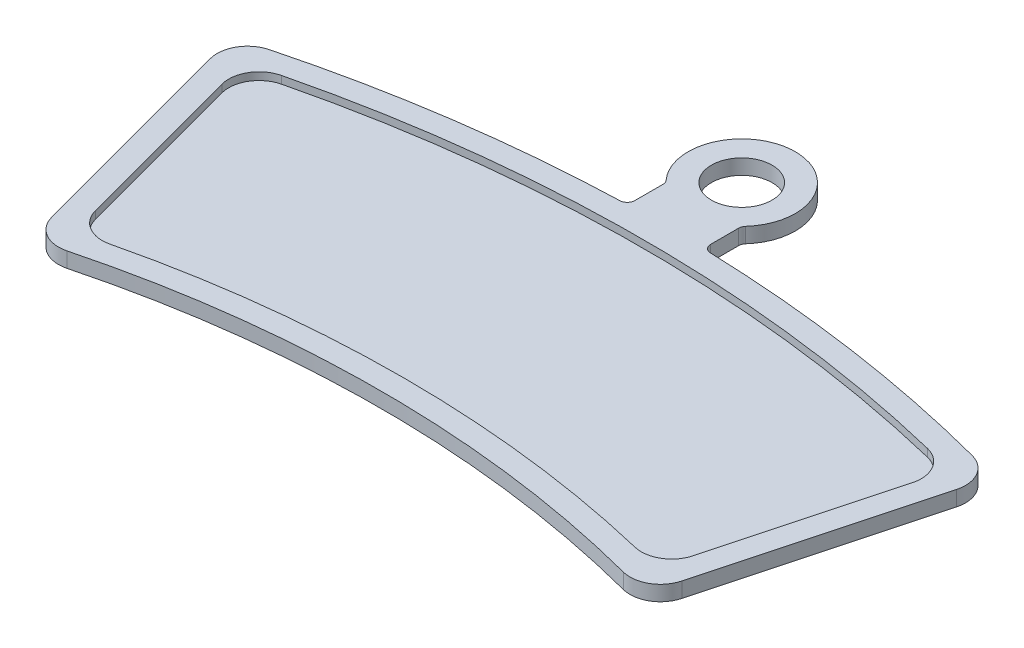
ISO-10303-21;
HEADER;
FILE_DESCRIPTION(('STEP AP214'),'2;1');
FILE_NAME('part.step','',(''),(''),'','','');
FILE_SCHEMA(('AUTOMOTIVE_DESIGN { 1 0 10303 214 1 1 1 1 }'));
ENDSEC;
DATA;
#1=APPLICATION_CONTEXT('core data for automotive mechanical design processes');
#2=APPLICATION_PROTOCOL_DEFINITION('international standard','automotive_design',2000,#1);
#3=PRODUCT_CONTEXT('',#1,'mechanical');
#4=PRODUCT('Part','Part','',(#3));
#5=PRODUCT_RELATED_PRODUCT_CATEGORY('part','',(#4));
#6=PRODUCT_DEFINITION_FORMATION('','',#4);
#7=PRODUCT_DEFINITION_CONTEXT('part definition',#1,'design');
#8=PRODUCT_DEFINITION('design','',#6,#7);
#9=PRODUCT_DEFINITION_SHAPE('','',#8);
#10=(LENGTH_UNIT() NAMED_UNIT(*) SI_UNIT(.MILLI.,.METRE.));
#11=(NAMED_UNIT(*) PLANE_ANGLE_UNIT() SI_UNIT($,.RADIAN.));
#12=(NAMED_UNIT(*) SI_UNIT($,.STERADIAN.) SOLID_ANGLE_UNIT());
#13=UNCERTAINTY_MEASURE_WITH_UNIT(LENGTH_MEASURE(1.E-05),#10,'distance_accuracy_value','');
#14=(GEOMETRIC_REPRESENTATION_CONTEXT(3) GLOBAL_UNCERTAINTY_ASSIGNED_CONTEXT((#13)) GLOBAL_UNIT_ASSIGNED_CONTEXT((#10,
#11,#12)) REPRESENTATION_CONTEXT('',''));
#15=CARTESIAN_POINT('',(0.,0.,0.));
#16=DIRECTION('',(0.,0.,1.));
#17=DIRECTION('',(1.,0.,0.));
#18=AXIS2_PLACEMENT_3D('',#15,#16,#17);
#19=CARTESIAN_POINT('',(0.,1.,0.));
#20=DIRECTION('',(0.,-1.,0.));
#21=DIRECTION('',(0.,0.,-1.));
#22=AXIS2_PLACEMENT_3D('',#19,#20,#21);
#23=CYLINDRICAL_SURFACE('',#22,91.5);
#24=CARTESIAN_POINT('',(0.,0.,0.));
#25=DIRECTION('',(0.,1.,0.));
#26=DIRECTION('',(0.,0.,1.));
#27=AXIS2_PLACEMENT_3D('',#24,#25,#26);
#28=CIRCLE('',#27,91.5);
#29=CARTESIAN_POINT('',(23.1878176866604,0.,-88.5131352451725));
#30=VERTEX_POINT('',#29);
#31=CARTESIAN_POINT('',(2.98346362364746,0.,-91.4513474193047));
#32=VERTEX_POINT('',#31);
#33=EDGE_CURVE('E365',#30,#32,#28,.T.);
#34=ORIENTED_EDGE('',*,*,#33,.T.);
#35=DIRECTION('',(0.,-1.,0.));
#36=VECTOR('',#35,1.);
#37=CARTESIAN_POINT('',(2.98346362364746,1.,-91.4513474193047));
#38=LINE('',#37,#36);
#39=CARTESIAN_POINT('',(2.98346362364746,1.,-91.4513474193047));
#40=VERTEX_POINT('',#39);
#41=EDGE_CURVE('E66',#32,#40,#38,.F.);
#42=ORIENTED_EDGE('',*,*,#41,.T.);
#43=CARTESIAN_POINT('',(0.,1.,0.));
#44=DIRECTION('',(0.,1.,0.));
#45=DIRECTION('',(0.,0.,1.));
#46=AXIS2_PLACEMENT_3D('',#43,#44,#45);
#47=CIRCLE('',#46,91.5);
#48=CARTESIAN_POINT('',(23.1878176866604,1.,-88.5131352451725));
#49=VERTEX_POINT('',#48);
#50=EDGE_CURVE('E243',#49,#40,#47,.T.);
#51=ORIENTED_EDGE('',*,*,#50,.F.);
#52=DIRECTION('',(0.,-1.,0.));
#53=VECTOR('',#52,1.);
#54=CARTESIAN_POINT('',(23.1878176866604,1.,-88.5131352451725));
#55=LINE('',#54,#53);
#56=EDGE_CURVE('E269',#49,#30,#55,.T.);
#57=ORIENTED_EDGE('',*,*,#56,.T.);
#58=EDGE_LOOP('',(#34,#42,#51,#57));
#59=FACE_BOUND('',#58,.T.);
#60=ADVANCED_FACE('F45',(#59),#23,.T.);
#61=CARTESIAN_POINT('',(2.49976670355811,1.,-91.4658469945355));
#62=DIRECTION('',(-1.,0.,0.));
#63=DIRECTION('',(0.,0.,1.));
#64=AXIS2_PLACEMENT_3D('',#61,#62,#63);
#65=PLANE('',#64);
#66=DIRECTION('',(0.,0.,-1.));
#67=VECTOR('',#66,1.);
#68=CARTESIAN_POINT('',(2.49976670355811,0.,-91.4658469945355));
#69=LINE('',#68,#67);
#70=CARTESIAN_POINT('',(2.49976670355811,0.,-91.951081558208));
#71=VERTEX_POINT('',#70);
#72=CARTESIAN_POINT('',(2.49976670355811,0.,-93.8008145227259));
#73=VERTEX_POINT('',#72);
#74=EDGE_CURVE('E360',#71,#73,#69,.T.);
#75=ORIENTED_EDGE('',*,*,#74,.T.);
#76=DIRECTION('',(0.,1.,0.));
#77=VECTOR('',#76,1.);
#78=CARTESIAN_POINT('',(2.49976670355811,1.,-93.8008145227259));
#79=LINE('',#78,#77);
#80=CARTESIAN_POINT('',(2.49976670355811,1.,-93.8008145227259));
#81=VERTEX_POINT('',#80);
#82=EDGE_CURVE('E316',#73,#81,#79,.T.);
#83=ORIENTED_EDGE('',*,*,#82,.T.);
#84=DIRECTION('',(0.,0.,-1.));
#85=VECTOR('',#84,1.);
#86=CARTESIAN_POINT('',(2.49976670355811,1.,-91.4658469945355));
#87=LINE('',#86,#85);
#88=CARTESIAN_POINT('',(2.49976670355811,1.,-91.951081558208));
#89=VERTEX_POINT('',#88);
#90=EDGE_CURVE('E378',#89,#81,#87,.T.);
#91=ORIENTED_EDGE('',*,*,#90,.F.);
#92=DIRECTION('',(0.,1.,0.));
#93=VECTOR('',#92,1.);
#94=CARTESIAN_POINT('',(2.49976670355811,0.,-91.951081558208));
#95=LINE('',#94,#93);
#96=EDGE_CURVE('E313',#89,#71,#95,.F.);
#97=ORIENTED_EDGE('',*,*,#96,.T.);
#98=EDGE_LOOP('',(#75,#83,#91,#97));
#99=FACE_BOUND('',#98,.T.);
#100=ADVANCED_FACE('F469',(#99),#65,.F.);
#101=CARTESIAN_POINT('',(0.,1.,-96.5));
#102=DIRECTION('',(0.,-1.,0.));
#103=DIRECTION('',(0.,0.,-1.));
#104=AXIS2_PLACEMENT_3D('',#101,#102,#103);
#105=CYLINDRICAL_SURFACE('',#104,3.53536894428541);
#106=CARTESIAN_POINT('',(0.,1.,-96.5));
#107=DIRECTION('',(0.,1.,0.));
#108=DIRECTION('',(0.,0.,1.));
#109=AXIS2_PLACEMENT_3D('',#106,#107,#108);
#110=CIRCLE('',#109,3.53536894428541);
#111=CARTESIAN_POINT('',(2.6280823860924,1.,-94.1352555013007));
#112=VERTEX_POINT('',#111);
#113=CARTESIAN_POINT('',(-2.62828677607677,1.,-94.1354826718931));
#114=VERTEX_POINT('',#113);
#115=EDGE_CURVE('E375',#112,#114,#110,.T.);
#116=ORIENTED_EDGE('',*,*,#115,.F.);
#117=DIRECTION('',(0.,-1.,0.));
#118=VECTOR('',#117,1.);
#119=CARTESIAN_POINT('',(2.6280823860924,1.,-94.1352555013007));
#120=LINE('',#119,#118);
#121=CARTESIAN_POINT('',(2.6280823860924,0.,-94.1352555013007));
#122=VERTEX_POINT('',#121);
#123=EDGE_CURVE('E310',#112,#122,#120,.T.);
#124=ORIENTED_EDGE('',*,*,#123,.T.);
#125=CARTESIAN_POINT('',(0.,0.,-96.5));
#126=DIRECTION('',(0.,1.,0.));
#127=DIRECTION('',(0.,0.,1.));
#128=AXIS2_PLACEMENT_3D('',#125,#126,#127);
#129=CIRCLE('',#128,3.53536894428541);
#130=CARTESIAN_POINT('',(-2.62828677607677,0.,-94.1354826718931));
#131=VERTEX_POINT('',#130);
#132=EDGE_CURVE('E358',#122,#131,#129,.T.);
#133=ORIENTED_EDGE('',*,*,#132,.T.);
#134=DIRECTION('',(0.,-1.,0.));
#135=VECTOR('',#134,1.);
#136=CARTESIAN_POINT('',(-2.62828677607677,1.,-94.1354826718931));
#137=LINE('',#136,#135);
#138=EDGE_CURVE('E308',#131,#114,#137,.F.);
#139=ORIENTED_EDGE('',*,*,#138,.T.);
#140=EDGE_LOOP('',(#116,#124,#133,#139));
#141=FACE_BOUND('',#140,.T.);
#142=ADVANCED_FACE('F474',(#141),#105,.T.);
#143=CARTESIAN_POINT('',(-2.5,1.,-91.465840618233));
#144=DIRECTION('',(1.,0.,0.));
#145=DIRECTION('',(0.,0.,-1.));
#146=AXIS2_PLACEMENT_3D('',#143,#144,#145);
#147=PLANE('',#146);
#148=DIRECTION('',(0.,0.,1.));
#149=VECTOR('',#148,1.);
#150=CARTESIAN_POINT('',(-2.5,1.,-91.465840618233));
#151=LINE('',#150,#149);
#152=CARTESIAN_POINT('',(-2.5,1.,-93.8010738215907));
#153=VERTEX_POINT('',#152);
#154=CARTESIAN_POINT('',(-2.5,1.,-91.9510739469637));
#155=VERTEX_POINT('',#154);
#156=EDGE_CURVE('E345',#153,#155,#151,.T.);
#157=ORIENTED_EDGE('',*,*,#156,.F.);
#158=DIRECTION('',(0.,1.,0.));
#159=VECTOR('',#158,1.);
#160=CARTESIAN_POINT('',(-2.5,0.,-93.8010738215907));
#161=LINE('',#160,#159);
#162=CARTESIAN_POINT('',(-2.5,0.,-93.8010738215907));
#163=VERTEX_POINT('',#162);
#164=EDGE_CURVE('E320',#153,#163,#161,.F.);
#165=ORIENTED_EDGE('',*,*,#164,.T.);
#166=DIRECTION('',(0.,0.,1.));
#167=VECTOR('',#166,1.);
#168=CARTESIAN_POINT('',(-2.5,0.,-91.465840618233));
#169=LINE('',#168,#167);
#170=CARTESIAN_POINT('',(-2.5,0.,-91.9510739469637));
#171=VERTEX_POINT('',#170);
#172=EDGE_CURVE('E237',#163,#171,#169,.T.);
#173=ORIENTED_EDGE('',*,*,#172,.T.);
#174=DIRECTION('',(0.,1.,0.));
#175=VECTOR('',#174,1.);
#176=CARTESIAN_POINT('',(-2.5,1.,-91.9510739469637));
#177=LINE('',#176,#175);
#178=EDGE_CURVE('E318',#171,#155,#177,.T.);
#179=ORIENTED_EDGE('',*,*,#178,.T.);
#180=EDGE_LOOP('',(#157,#165,#173,#179));
#181=FACE_BOUND('',#180,.T.);
#182=ADVANCED_FACE('F356',(#181),#147,.F.);
#183=CARTESIAN_POINT('',(0.,1.,0.));
#184=DIRECTION('',(0.,-1.,0.));
#185=DIRECTION('',(0.,0.,-1.));
#186=AXIS2_PLACEMENT_3D('',#183,#184,#185);
#187=CYLINDRICAL_SURFACE('',#186,91.5);
#188=CARTESIAN_POINT('',(0.,1.,0.));
#189=DIRECTION('',(0.,1.,0.));
#190=DIRECTION('',(0.,0.,1.));
#191=AXIS2_PLACEMENT_3D('',#188,#189,#190);
#192=CIRCLE('',#191,91.5);
#193=CARTESIAN_POINT('',(-2.98369565217391,1.,-91.4513398494259));
#194=VERTEX_POINT('',#193);
#195=CARTESIAN_POINT('',(-23.1878176866604,1.,-88.5131352451725));
#196=VERTEX_POINT('',#195);
#197=EDGE_CURVE('E343',#194,#196,#192,.T.);
#198=ORIENTED_EDGE('',*,*,#197,.F.);
#199=DIRECTION('',(0.,-1.,0.));
#200=VECTOR('',#199,1.);
#201=CARTESIAN_POINT('',(-2.98369565217391,1.,-91.4513398494259));
#202=LINE('',#201,#200);
#203=CARTESIAN_POINT('',(-2.98369565217391,0.,-91.4513398494259));
#204=VERTEX_POINT('',#203);
#205=EDGE_CURVE('E323',#194,#204,#202,.T.);
#206=ORIENTED_EDGE('',*,*,#205,.T.);
#207=CARTESIAN_POINT('',(0.,0.,0.));
#208=DIRECTION('',(0.,1.,0.));
#209=DIRECTION('',(0.,0.,1.));
#210=AXIS2_PLACEMENT_3D('',#207,#208,#209);
#211=CIRCLE('',#210,91.5);
#212=CARTESIAN_POINT('',(-23.1878176866604,0.,-88.5131352451725));
#213=VERTEX_POINT('',#212);
#214=EDGE_CURVE('E232',#204,#213,#211,.T.);
#215=ORIENTED_EDGE('',*,*,#214,.T.);
#216=DIRECTION('',(0.,-1.,0.));
#217=VECTOR('',#216,1.);
#218=CARTESIAN_POINT('',(-23.1878176866604,1.,-88.5131352451725));
#219=LINE('',#218,#217);
#220=EDGE_CURVE('E213',#213,#196,#219,.F.);
#221=ORIENTED_EDGE('',*,*,#220,.T.);
#222=EDGE_LOOP('',(#198,#206,#215,#221));
#223=FACE_BOUND('',#222,.T.);
#224=ADVANCED_FACE('F350',(#223),#187,.T.);
#225=CARTESIAN_POINT('',(-25.1276489511106,1.,-87.9821076025674));
#226=DIRECTION('',(0.96592582628907,0.,-0.258819045102514));
#227=DIRECTION('',(-0.258819045102514,0.,-0.96592582628907));
#228=AXIS2_PLACEMENT_3D('',#225,#226,#227);
#229=PLANE('',#228);
#230=DIRECTION('',(0.258819045102514,0.,0.96592582628907));
#231=VECTOR('',#230,1.);
#232=CARTESIAN_POINT('',(-25.1276489511106,1.,-87.9821076025674));
#233=LINE('',#232,#231);
#234=CARTESIAN_POINT('',(-24.6128317941749,1.,-86.0607838162752));
#235=VERTEX_POINT('',#234);
#236=CARTESIAN_POINT('',(-20.7822383062754,1.,-71.7648142962913));
#237=VERTEX_POINT('',#236);
#238=EDGE_CURVE('E225',#235,#237,#233,.T.);
#239=ORIENTED_EDGE('',*,*,#238,.F.);
#240=DIRECTION('',(0.,-1.,0.));
#241=VECTOR('',#240,1.);
#242=CARTESIAN_POINT('',(-24.6128317941749,1.,-86.0607838162752));
#243=LINE('',#242,#241);
#244=CARTESIAN_POINT('',(-24.6128317941749,0.,-86.0607838162752));
#245=VERTEX_POINT('',#244);
#246=EDGE_CURVE('E211',#235,#245,#243,.T.);
#247=ORIENTED_EDGE('',*,*,#246,.T.);
#248=DIRECTION('',(0.258819045102514,0.,0.96592582628907));
#249=VECTOR('',#248,1.);
#250=CARTESIAN_POINT('',(-25.1276489511106,0.,-87.9821076025674));
#251=LINE('',#250,#249);
#252=CARTESIAN_POINT('',(-20.7822383062754,0.,-71.7648142962913));
#253=VERTEX_POINT('',#252);
#254=EDGE_CURVE('E222',#245,#253,#251,.T.);
#255=ORIENTED_EDGE('',*,*,#254,.T.);
#256=DIRECTION('',(0.,-1.,0.));
#257=VECTOR('',#256,1.);
#258=CARTESIAN_POINT('',(-20.7822383062754,1.,-71.7648142962913));
#259=LINE('',#258,#257);
#260=EDGE_CURVE('E227',#253,#237,#259,.F.);
#261=ORIENTED_EDGE('',*,*,#260,.T.);
#262=EDGE_LOOP('',(#239,#247,#255,#261));
#263=FACE_BOUND('',#262,.T.);
#264=ADVANCED_FACE('F221',(#263),#229,.F.);
#265=CARTESIAN_POINT('',(0.,1.,0.));
#266=DIRECTION('',(0.,-1.,0.));
#267=DIRECTION('',(0.,0.,-1.));
#268=AXIS2_PLACEMENT_3D('',#265,#266,#267);
#269=CYLINDRICAL_SURFACE('',#268,72.7);
#270=CARTESIAN_POINT('',(0.,1.,0.));
#271=DIRECTION('',(0.,-1.,0.));
#272=DIRECTION('',(0.,0.,1.));
#273=AXIS2_PLACEMENT_3D('',#270,#271,#272);
#274=CIRCLE('',#273,72.7);
#275=CARTESIAN_POINT('',(-18.3456908932234,1.,-70.3471792302314));
#276=VERTEX_POINT('',#275);
#277=CARTESIAN_POINT('',(18.3456908932234,1.,-70.3471792302314));
#278=VERTEX_POINT('',#277);
#279=EDGE_CURVE('E370',#276,#278,#274,.T.);
#280=ORIENTED_EDGE('',*,*,#279,.F.);
#281=DIRECTION('',(0.,-1.,0.));
#282=VECTOR('',#281,1.);
#283=CARTESIAN_POINT('',(-18.3456908932234,1.,-70.3471792302314));
#284=LINE('',#283,#282);
#285=CARTESIAN_POINT('',(-18.3456908932234,0.,-70.3471792302314));
#286=VERTEX_POINT('',#285);
#287=EDGE_CURVE('E261',#276,#286,#284,.T.);
#288=ORIENTED_EDGE('',*,*,#287,.T.);
#289=CARTESIAN_POINT('',(0.,0.,0.));
#290=DIRECTION('',(0.,-1.,0.));
#291=DIRECTION('',(0.,0.,1.));
#292=AXIS2_PLACEMENT_3D('',#289,#290,#291);
#293=CIRCLE('',#292,72.7);
#294=CARTESIAN_POINT('',(18.3456908932234,0.,-70.3471792302314));
#295=VERTEX_POINT('',#294);
#296=EDGE_CURVE('E231',#286,#295,#293,.T.);
#297=ORIENTED_EDGE('',*,*,#296,.T.);
#298=DIRECTION('',(0.,-1.,0.));
#299=VECTOR('',#298,1.);
#300=CARTESIAN_POINT('',(18.3456908932234,1.,-70.3471792302314));
#301=LINE('',#300,#299);
#302=EDGE_CURVE('E259',#295,#278,#301,.F.);
#303=ORIENTED_EDGE('',*,*,#302,.T.);
#304=EDGE_LOOP('',(#280,#288,#297,#303));
#305=FACE_BOUND('',#304,.T.);
#306=ADVANCED_FACE('F501',(#305),#269,.F.);
#307=CARTESIAN_POINT('',(25.1276489511106,1.,-87.9821076025674));
#308=DIRECTION('',(-0.96592582628907,0.,-0.258819045102514));
#309=DIRECTION('',(-0.258819045102514,0.,0.96592582628907));
#310=AXIS2_PLACEMENT_3D('',#307,#308,#309);
#311=PLANE('',#310);
#312=DIRECTION('',(0.258819045102514,0.,-0.96592582628907));
#313=VECTOR('',#312,1.);
#314=CARTESIAN_POINT('',(25.1276489511106,1.,-87.9821076025674));
#315=LINE('',#314,#313);
#316=CARTESIAN_POINT('',(20.7822383062754,1.,-71.7648142962913));
#317=VERTEX_POINT('',#316);
#318=CARTESIAN_POINT('',(24.6128317941749,1.,-86.0607838162752));
#319=VERTEX_POINT('',#318);
#320=EDGE_CURVE('E244',#317,#319,#315,.T.);
#321=ORIENTED_EDGE('',*,*,#320,.F.);
#322=DIRECTION('',(0.,-1.,0.));
#323=VECTOR('',#322,1.);
#324=CARTESIAN_POINT('',(20.7822383062754,1.,-71.7648142962913));
#325=LINE('',#324,#323);
#326=CARTESIAN_POINT('',(20.7822383062754,0.,-71.7648142962913));
#327=VERTEX_POINT('',#326);
#328=EDGE_CURVE('E266',#317,#327,#325,.T.);
#329=ORIENTED_EDGE('',*,*,#328,.T.);
#330=DIRECTION('',(0.258819045102514,0.,-0.96592582628907));
#331=VECTOR('',#330,1.);
#332=CARTESIAN_POINT('',(25.1276489511106,0.,-87.9821076025674));
#333=LINE('',#332,#331);
#334=CARTESIAN_POINT('',(24.6128317941749,0.,-86.0607838162752));
#335=VERTEX_POINT('',#334);
#336=EDGE_CURVE('E235',#327,#335,#333,.T.);
#337=ORIENTED_EDGE('',*,*,#336,.T.);
#338=DIRECTION('',(0.,-1.,0.));
#339=VECTOR('',#338,1.);
#340=CARTESIAN_POINT('',(24.6128317941749,1.,-86.0607838162752));
#341=LINE('',#340,#339);
#342=EDGE_CURVE('E264',#335,#319,#341,.F.);
#343=ORIENTED_EDGE('',*,*,#342,.T.);
#344=EDGE_LOOP('',(#321,#329,#337,#343));
#345=FACE_BOUND('',#344,.T.);
#346=ADVANCED_FACE('F416',(#345),#311,.F.);
#347=CARTESIAN_POINT('',(0.,1.,0.));
#348=DIRECTION('',(0.,1.,0.));
#349=DIRECTION('',(0.,0.,1.));
#350=AXIS2_PLACEMENT_3D('',#347,#348,#349);
#351=PLANE('',#350);
#352=CARTESIAN_POINT('',(0.,1.,-96.5));
#353=DIRECTION('',(0.,1.,0.));
#354=DIRECTION('',(0.,0.,1.));
#355=AXIS2_PLACEMENT_3D('',#352,#353,#354);
#356=CIRCLE('',#355,2.);
#357=CARTESIAN_POINT('',(0.,1.,-94.5));
#358=VERTEX_POINT('',#357);
#359=EDGE_CURVE('E408',#358,#358,#356,.T.);
#360=ORIENTED_EDGE('',*,*,#359,.F.);
#361=EDGE_LOOP('',(#360));
#362=FACE_BOUND('',#361,.T.);
#363=CARTESIAN_POINT('',(0.,1.,-5.82867087928207E-13));
#364=DIRECTION('',(0.,-1.,0.));
#365=DIRECTION('',(0.,0.,-1.));
#366=AXIS2_PLACEMENT_3D('',#363,#364,#365);
#367=CIRCLE('',#366,74.1999999999994);
#368=CARTESIAN_POINT('',(-17.316610269324,1.,-72.1510568791639));
#369=VERTEX_POINT('',#368);
#370=CARTESIAN_POINT('',(17.3166102693241,1.,-72.1510568791639));
#371=VERTEX_POINT('',#370);
#372=EDGE_CURVE('E392',#369,#371,#367,.T.);
#373=ORIENTED_EDGE('',*,*,#372,.F.);
#374=CARTESIAN_POINT('',(-17.7833652631064,1.,-74.0958293017828));
#375=DIRECTION('',(0.,1.,0.));
#376=DIRECTION('',(0.,0.,1.));
#377=AXIS2_PLACEMENT_3D('',#374,#375,#376);
#378=CIRCLE('',#377,2.);
#379=CARTESIAN_POINT('',(-19.7152169156845,1.,-73.5781912115778));
#380=VERTEX_POINT('',#379);
#381=EDGE_CURVE('E300',#369,#380,#378,.F.);
#382=ORIENTED_EDGE('',*,*,#381,.T.);
#383=DIRECTION('',(0.258819045102514,0.,0.96592582628907));
#384=VECTOR('',#383,1.);
#385=CARTESIAN_POINT('',(-23.2937140592263,1.,-86.9333243660163));
#386=LINE('',#385,#384);
#387=CARTESIAN_POINT('',(-22.7701929582118,1.,-84.9795170181956));
#388=VERTEX_POINT('',#387);
#389=EDGE_CURVE('E382',#388,#380,#386,.T.);
#390=ORIENTED_EDGE('',*,*,#389,.F.);
#391=CARTESIAN_POINT('',(-20.8383413056336,1.,-85.4971551084006));
#392=DIRECTION('',(0.,1.,0.));
#393=DIRECTION('',(0.,0.,1.));
#394=AXIS2_PLACEMENT_3D('',#391,#392,#393);
#395=CIRCLE('',#394,2.);
#396=CARTESIAN_POINT('',(-21.3119399716708,1.,-87.4402722699552));
#397=VERTEX_POINT('',#396);
#398=EDGE_CURVE('E306',#388,#397,#395,.F.);
#399=ORIENTED_EDGE('',*,*,#398,.T.);
#400=CARTESIAN_POINT('',(-1.04083408558608E-13,1.,-8.88178419700125E-13));
#401=DIRECTION('',(0.,1.,0.));
#402=DIRECTION('',(0.,0.,-1.));
#403=AXIS2_PLACEMENT_3D('',#400,#401,#402);
#404=CIRCLE('',#403,89.9999999999991);
#405=CARTESIAN_POINT('',(21.3119399716708,1.,-87.4402722699552));
#406=VERTEX_POINT('',#405);
#407=EDGE_CURVE('E386',#406,#397,#404,.T.);
#408=ORIENTED_EDGE('',*,*,#407,.F.);
#409=CARTESIAN_POINT('',(20.8383413056336,1.,-85.4971551084006));
#410=DIRECTION('',(0.,1.,0.));
#411=DIRECTION('',(0.,0.,1.));
#412=AXIS2_PLACEMENT_3D('',#409,#410,#411);
#413=CIRCLE('',#412,2.);
#414=CARTESIAN_POINT('',(22.7701929582118,1.,-84.9795170181956));
#415=VERTEX_POINT('',#414);
#416=EDGE_CURVE('E304',#406,#415,#413,.F.);
#417=ORIENTED_EDGE('',*,*,#416,.T.);
#418=DIRECTION('',(0.258819045102514,0.,-0.96592582628907));
#419=VECTOR('',#418,1.);
#420=CARTESIAN_POINT('',(19.2043731466066,1.,-71.6716963106489));
#421=LINE('',#420,#419);
#422=CARTESIAN_POINT('',(19.7152169156845,1.,-73.5781912115778));
#423=VERTEX_POINT('',#422);
#424=EDGE_CURVE('E389',#423,#415,#421,.T.);
#425=ORIENTED_EDGE('',*,*,#424,.F.);
#426=CARTESIAN_POINT('',(17.7833652631064,1.,-74.0958293017828));
#427=DIRECTION('',(0.,1.,0.));
#428=DIRECTION('',(0.,0.,1.));
#429=AXIS2_PLACEMENT_3D('',#426,#427,#428);
#430=CIRCLE('',#429,2.);
#431=EDGE_CURVE('E302',#423,#371,#430,.F.);
#432=ORIENTED_EDGE('',*,*,#431,.T.);
#433=EDGE_LOOP('',(#373,#382,#390,#399,#408,#417,#425,#432));
#434=FACE_BOUND('',#433,.T.);
#435=ORIENTED_EDGE('',*,*,#156,.T.);
#436=CARTESIAN_POINT('',(-3.,1.,-91.9510739469637));
#437=DIRECTION('',(0.,1.,0.));
#438=DIRECTION('',(0.,0.,1.));
#439=AXIS2_PLACEMENT_3D('',#436,#437,#438);
#440=CIRCLE('',#439,0.5);
#441=EDGE_CURVE('E337',#155,#194,#440,.F.);
#442=ORIENTED_EDGE('',*,*,#441,.T.);
#443=ORIENTED_EDGE('',*,*,#197,.T.);
#444=CARTESIAN_POINT('',(-22.6809801415968,1.,-86.5784219064802));
#445=DIRECTION('',(0.,1.,0.));
#446=DIRECTION('',(0.,0.,1.));
#447=AXIS2_PLACEMENT_3D('',#444,#445,#446);
#448=CIRCLE('',#447,2.);
#449=EDGE_CURVE('E257',#196,#235,#448,.T.);
#450=ORIENTED_EDGE('',*,*,#449,.T.);
#451=ORIENTED_EDGE('',*,*,#238,.T.);
#452=CARTESIAN_POINT('',(-18.8503866536972,1.,-72.2824523864963));
#453=DIRECTION('',(0.,1.,0.));
#454=DIRECTION('',(0.,0.,1.));
#455=AXIS2_PLACEMENT_3D('',#452,#453,#454);
#456=CIRCLE('',#455,2.);
#457=EDGE_CURVE('E255',#237,#276,#456,.T.);
#458=ORIENTED_EDGE('',*,*,#457,.T.);
#459=ORIENTED_EDGE('',*,*,#279,.T.);
#460=CARTESIAN_POINT('',(18.8503866536972,1.,-72.2824523864963));
#461=DIRECTION('',(0.,1.,0.));
#462=DIRECTION('',(0.,0.,1.));
#463=AXIS2_PLACEMENT_3D('',#460,#461,#462);
#464=CIRCLE('',#463,2.);
#465=EDGE_CURVE('E253',#278,#317,#464,.T.);
#466=ORIENTED_EDGE('',*,*,#465,.T.);
#467=ORIENTED_EDGE('',*,*,#320,.T.);
#468=CARTESIAN_POINT('',(22.6809801415968,1.,-86.5784219064802));
#469=DIRECTION('',(0.,1.,0.));
#470=DIRECTION('',(0.,0.,1.));
#471=AXIS2_PLACEMENT_3D('',#468,#469,#470);
#472=CIRCLE('',#471,2.);
#473=EDGE_CURVE('E251',#319,#49,#472,.T.);
#474=ORIENTED_EDGE('',*,*,#473,.T.);
#475=ORIENTED_EDGE('',*,*,#50,.T.);
#476=CARTESIAN_POINT('',(2.99976670355811,1.,-91.951081558208));
#477=DIRECTION('',(0.,1.,0.));
#478=DIRECTION('',(0.,0.,1.));
#479=AXIS2_PLACEMENT_3D('',#476,#477,#478);
#480=CIRCLE('',#479,0.5);
#481=EDGE_CURVE('E11',#40,#89,#480,.F.);
#482=ORIENTED_EDGE('',*,*,#481,.T.);
#483=ORIENTED_EDGE('',*,*,#90,.T.);
#484=CARTESIAN_POINT('',(2.99976670355811,1.,-93.8008145227259));
#485=DIRECTION('',(0.,1.,0.));
#486=DIRECTION('',(0.,0.,1.));
#487=AXIS2_PLACEMENT_3D('',#484,#485,#486);
#488=CIRCLE('',#487,0.5);
#489=EDGE_CURVE('E329',#81,#112,#488,.F.);
#490=ORIENTED_EDGE('',*,*,#489,.T.);
#491=ORIENTED_EDGE('',*,*,#115,.T.);
#492=CARTESIAN_POINT('',(-3.,1.,-93.8010738215907));
#493=DIRECTION('',(0.,1.,0.));
#494=DIRECTION('',(0.,0.,1.));
#495=AXIS2_PLACEMENT_3D('',#492,#493,#494);
#496=CIRCLE('',#495,0.5);
#497=EDGE_CURVE('E333',#114,#153,#496,.F.);
#498=ORIENTED_EDGE('',*,*,#497,.T.);
#499=EDGE_LOOP('',(#435,#442,#443,#450,#451,#458,#459,#466,#467,#474,#475,#482,#483,#490,#491,#498));
#500=FACE_BOUND('',#499,.T.);
#501=ADVANCED_FACE('F342',(#362,#434,#500),#351,.T.);
#502=CARTESIAN_POINT('',(0.,0.,0.));
#503=DIRECTION('',(0.,1.,0.));
#504=DIRECTION('',(0.,0.,1.));
#505=AXIS2_PLACEMENT_3D('',#502,#503,#504);
#506=PLANE('',#505);
#507=CARTESIAN_POINT('',(0.,0.,-96.5));
#508=DIRECTION('',(0.,1.,0.));
#509=DIRECTION('',(0.,0.,1.));
#510=AXIS2_PLACEMENT_3D('',#507,#508,#509);
#511=CIRCLE('',#510,2.);
#512=CARTESIAN_POINT('',(0.,0.,-94.5));
#513=VERTEX_POINT('',#512);
#514=EDGE_CURVE('E395',#513,#513,#511,.T.);
#515=ORIENTED_EDGE('',*,*,#514,.T.);
#516=EDGE_LOOP('',(#515));
#517=FACE_BOUND('',#516,.T.);
#518=ORIENTED_EDGE('',*,*,#254,.F.);
#519=CARTESIAN_POINT('',(-22.6809801415968,0.,-86.5784219064802));
#520=DIRECTION('',(0.,1.,0.));
#521=DIRECTION('',(0.,0.,1.));
#522=AXIS2_PLACEMENT_3D('',#519,#520,#521);
#523=CIRCLE('',#522,2.);
#524=EDGE_CURVE('E207',#245,#213,#523,.F.);
#525=ORIENTED_EDGE('',*,*,#524,.T.);
#526=ORIENTED_EDGE('',*,*,#214,.F.);
#527=CARTESIAN_POINT('',(-3.,0.,-91.9510739469637));
#528=DIRECTION('',(0.,1.,0.));
#529=DIRECTION('',(0.,0.,1.));
#530=AXIS2_PLACEMENT_3D('',#527,#528,#529);
#531=CIRCLE('',#530,0.5);
#532=EDGE_CURVE('E335',#204,#171,#531,.T.);
#533=ORIENTED_EDGE('',*,*,#532,.T.);
#534=ORIENTED_EDGE('',*,*,#172,.F.);
#535=CARTESIAN_POINT('',(-3.,0.,-93.8010738215907));
#536=DIRECTION('',(0.,1.,0.));
#537=DIRECTION('',(0.,0.,1.));
#538=AXIS2_PLACEMENT_3D('',#535,#536,#537);
#539=CIRCLE('',#538,0.5);
#540=EDGE_CURVE('E331',#163,#131,#539,.T.);
#541=ORIENTED_EDGE('',*,*,#540,.T.);
#542=ORIENTED_EDGE('',*,*,#132,.F.);
#543=CARTESIAN_POINT('',(2.99976670355811,0.,-93.8008145227259));
#544=DIRECTION('',(0.,1.,0.));
#545=DIRECTION('',(0.,0.,1.));
#546=AXIS2_PLACEMENT_3D('',#543,#544,#545);
#547=CIRCLE('',#546,0.5);
#548=EDGE_CURVE('E327',#122,#73,#547,.T.);
#549=ORIENTED_EDGE('',*,*,#548,.T.);
#550=ORIENTED_EDGE('',*,*,#74,.F.);
#551=CARTESIAN_POINT('',(2.99976670355811,0.,-91.951081558208));
#552=DIRECTION('',(0.,1.,0.));
#553=DIRECTION('',(0.,0.,1.));
#554=AXIS2_PLACEMENT_3D('',#551,#552,#553);
#555=CIRCLE('',#554,0.5);
#556=EDGE_CURVE('E53',#71,#32,#555,.T.);
#557=ORIENTED_EDGE('',*,*,#556,.T.);
#558=ORIENTED_EDGE('',*,*,#33,.F.);
#559=CARTESIAN_POINT('',(22.6809801415968,0.,-86.5784219064802));
#560=DIRECTION('',(0.,1.,0.));
#561=DIRECTION('',(0.,0.,1.));
#562=AXIS2_PLACEMENT_3D('',#559,#560,#561);
#563=CIRCLE('',#562,2.);
#564=EDGE_CURVE('E226',#30,#335,#563,.F.);
#565=ORIENTED_EDGE('',*,*,#564,.T.);
#566=ORIENTED_EDGE('',*,*,#336,.F.);
#567=CARTESIAN_POINT('',(18.8503866536972,0.,-72.2824523864963));
#568=DIRECTION('',(0.,1.,0.));
#569=DIRECTION('',(0.,0.,1.));
#570=AXIS2_PLACEMENT_3D('',#567,#568,#569);
#571=CIRCLE('',#570,2.);
#572=EDGE_CURVE('E247',#327,#295,#571,.F.);
#573=ORIENTED_EDGE('',*,*,#572,.T.);
#574=ORIENTED_EDGE('',*,*,#296,.F.);
#575=CARTESIAN_POINT('',(-18.8503866536972,0.,-72.2824523864963));
#576=DIRECTION('',(0.,1.,0.));
#577=DIRECTION('',(0.,0.,1.));
#578=AXIS2_PLACEMENT_3D('',#575,#576,#577);
#579=CIRCLE('',#578,2.);
#580=EDGE_CURVE('E216',#286,#253,#579,.F.);
#581=ORIENTED_EDGE('',*,*,#580,.T.);
#582=EDGE_LOOP('',(#518,#525,#526,#533,#534,#541,#542,#549,#550,#557,#558,#565,#566,#573,#574,#581));
#583=FACE_BOUND('',#582,.T.);
#584=ADVANCED_FACE('F229',(#517,#583),#506,.F.);
#585=CARTESIAN_POINT('',(0.,0.5,-5.82867087928207E-13));
#586=DIRECTION('',(0.,1.,0.));
#587=DIRECTION('',(0.,0.,1.));
#588=AXIS2_PLACEMENT_3D('',#585,#586,#587);
#589=CYLINDRICAL_SURFACE('',#588,74.1999999999994);
#590=CARTESIAN_POINT('',(0.,0.5,-5.82867087928207E-13));
#591=DIRECTION('',(0.,-1.,0.));
#592=DIRECTION('',(0.,0.,-1.));
#593=AXIS2_PLACEMENT_3D('',#590,#591,#592);
#594=CIRCLE('',#593,74.1999999999994);
#595=CARTESIAN_POINT('',(-17.316610269324,0.5,-72.1510568791639));
#596=VERTEX_POINT('',#595);
#597=CARTESIAN_POINT('',(17.3166102693241,0.5,-72.1510568791639));
#598=VERTEX_POINT('',#597);
#599=EDGE_CURVE('E385',#596,#598,#594,.T.);
#600=ORIENTED_EDGE('',*,*,#599,.F.);
#601=DIRECTION('',(0.,1.,0.));
#602=VECTOR('',#601,1.);
#603=CARTESIAN_POINT('',(-17.316610269324,0.5,-72.1510568791639));
#604=LINE('',#603,#602);
#605=EDGE_CURVE('E274',#596,#369,#604,.T.);
#606=ORIENTED_EDGE('',*,*,#605,.T.);
#607=ORIENTED_EDGE('',*,*,#372,.T.);
#608=DIRECTION('',(0.,1.,0.));
#609=VECTOR('',#608,1.);
#610=CARTESIAN_POINT('',(17.3166102693241,0.5,-72.1510568791639));
#611=LINE('',#610,#609);
#612=EDGE_CURVE('E272',#371,#598,#611,.F.);
#613=ORIENTED_EDGE('',*,*,#612,.T.);
#614=EDGE_LOOP('',(#600,#606,#607,#613));
#615=FACE_BOUND('',#614,.T.);
#616=ADVANCED_FACE('F424',(#615),#589,.T.);
#617=CARTESIAN_POINT('',(-23.2937140592263,0.5,-86.9333243660163));
#618=DIRECTION('',(-0.96592582628907,0.,0.258819045102514));
#619=DIRECTION('',(0.258819045102514,0.,0.96592582628907));
#620=AXIS2_PLACEMENT_3D('',#617,#618,#619);
#621=PLANE('',#620);
#622=ORIENTED_EDGE('',*,*,#389,.T.);
#623=DIRECTION('',(0.,-1.,0.));
#624=VECTOR('',#623,1.);
#625=CARTESIAN_POINT('',(-19.7152169156845,0.5,-73.5781912115778));
#626=LINE('',#625,#624);
#627=CARTESIAN_POINT('',(-19.7152169156845,0.5,-73.5781912115778));
#628=VERTEX_POINT('',#627);
#629=EDGE_CURVE('E280',#380,#628,#626,.T.);
#630=ORIENTED_EDGE('',*,*,#629,.T.);
#631=DIRECTION('',(0.258819045102514,0.,0.96592582628907));
#632=VECTOR('',#631,1.);
#633=CARTESIAN_POINT('',(-23.2937140592263,0.5,-86.9333243660163));
#634=LINE('',#633,#632);
#635=CARTESIAN_POINT('',(-22.7701929582118,0.5,-84.9795170181956));
#636=VERTEX_POINT('',#635);
#637=EDGE_CURVE('E367',#636,#628,#634,.T.);
#638=ORIENTED_EDGE('',*,*,#637,.F.);
#639=DIRECTION('',(0.,-1.,0.));
#640=VECTOR('',#639,1.);
#641=CARTESIAN_POINT('',(-22.7701929582118,1.,-84.9795170181956));
#642=LINE('',#641,#640);
#643=EDGE_CURVE('E277',#636,#388,#642,.F.);
#644=ORIENTED_EDGE('',*,*,#643,.T.);
#645=EDGE_LOOP('',(#622,#630,#638,#644));
#646=FACE_BOUND('',#645,.T.);
#647=ADVANCED_FACE('F452',(#646),#621,.F.);
#648=CARTESIAN_POINT('',(-1.04083408558608E-13,0.5,-8.88178419700125E-13));
#649=DIRECTION('',(0.,1.,0.));
#650=DIRECTION('',(0.,0.,1.));
#651=AXIS2_PLACEMENT_3D('',#648,#649,#650);
#652=CYLINDRICAL_SURFACE('',#651,89.9999999999991);
#653=CARTESIAN_POINT('',(-1.04083408558608E-13,0.5,-8.88178419700125E-13));
#654=DIRECTION('',(0.,1.,0.));
#655=DIRECTION('',(0.,0.,-1.));
#656=AXIS2_PLACEMENT_3D('',#653,#654,#655);
#657=CIRCLE('',#656,89.9999999999991);
#658=CARTESIAN_POINT('',(21.3119399716708,0.5,-87.4402722699552));
#659=VERTEX_POINT('',#658);
#660=CARTESIAN_POINT('',(-21.3119399716708,0.5,-87.4402722699552));
#661=VERTEX_POINT('',#660);
#662=EDGE_CURVE('E398',#659,#661,#657,.T.);
#663=ORIENTED_EDGE('',*,*,#662,.F.);
#664=DIRECTION('',(0.,1.,0.));
#665=VECTOR('',#664,1.);
#666=CARTESIAN_POINT('',(21.3119399716708,0.5,-87.4402722699552));
#667=LINE('',#666,#665);
#668=EDGE_CURVE('E297',#659,#406,#667,.T.);
#669=ORIENTED_EDGE('',*,*,#668,.T.);
#670=ORIENTED_EDGE('',*,*,#407,.T.);
#671=DIRECTION('',(0.,1.,0.));
#672=VECTOR('',#671,1.);
#673=CARTESIAN_POINT('',(-21.3119399716708,0.5,-87.4402722699552));
#674=LINE('',#673,#672);
#675=EDGE_CURVE('E295',#397,#661,#674,.F.);
#676=ORIENTED_EDGE('',*,*,#675,.T.);
#677=EDGE_LOOP('',(#663,#669,#670,#676));
#678=FACE_BOUND('',#677,.T.);
#679=ADVANCED_FACE('F443',(#678),#652,.F.);
#680=CARTESIAN_POINT('',(19.2043731466066,0.5,-71.6716963106489));
#681=DIRECTION('',(0.96592582628907,0.,0.258819045102514));
#682=DIRECTION('',(0.258819045102514,0.,-0.96592582628907));
#683=AXIS2_PLACEMENT_3D('',#680,#681,#682);
#684=PLANE('',#683);
#685=DIRECTION('',(0.258819045102514,0.,-0.96592582628907));
#686=VECTOR('',#685,1.);
#687=CARTESIAN_POINT('',(19.2043731466066,0.5,-71.6716963106489));
#688=LINE('',#687,#686);
#689=CARTESIAN_POINT('',(19.7152169156845,0.5,-73.5781912115778));
#690=VERTEX_POINT('',#689);
#691=CARTESIAN_POINT('',(22.7701929582118,0.5,-84.9795170181956));
#692=VERTEX_POINT('',#691);
#693=EDGE_CURVE('E401',#690,#692,#688,.T.);
#694=ORIENTED_EDGE('',*,*,#693,.F.);
#695=DIRECTION('',(0.,-1.,0.));
#696=VECTOR('',#695,1.);
#697=CARTESIAN_POINT('',(19.7152169156845,1.,-73.5781912115778));
#698=LINE('',#697,#696);
#699=EDGE_CURVE('E292',#690,#423,#698,.F.);
#700=ORIENTED_EDGE('',*,*,#699,.T.);
#701=ORIENTED_EDGE('',*,*,#424,.T.);
#702=DIRECTION('',(0.,-1.,0.));
#703=VECTOR('',#702,1.);
#704=CARTESIAN_POINT('',(22.7701929582118,0.5,-84.9795170181956));
#705=LINE('',#704,#703);
#706=EDGE_CURVE('E290',#415,#692,#705,.T.);
#707=ORIENTED_EDGE('',*,*,#706,.T.);
#708=EDGE_LOOP('',(#694,#700,#701,#707));
#709=FACE_BOUND('',#708,.T.);
#710=ADVANCED_FACE('F435',(#709),#684,.F.);
#711=CARTESIAN_POINT('',(0.,0.5,-5.82867087928207E-13));
#712=DIRECTION('',(0.,-1.,0.));
#713=DIRECTION('',(0.,0.,-1.));
#714=AXIS2_PLACEMENT_3D('',#711,#712,#713);
#715=PLANE('',#714);
#716=ORIENTED_EDGE('',*,*,#637,.T.);
#717=CARTESIAN_POINT('',(-17.7833652631064,0.5,-74.0958293017828));
#718=DIRECTION('',(0.,-1.,0.));
#719=DIRECTION('',(0.,0.,-1.));
#720=AXIS2_PLACEMENT_3D('',#717,#718,#719);
#721=CIRCLE('',#720,2.);
#722=EDGE_CURVE('E288',#628,#596,#721,.F.);
#723=ORIENTED_EDGE('',*,*,#722,.T.);
#724=ORIENTED_EDGE('',*,*,#599,.T.);
#725=CARTESIAN_POINT('',(17.7833652631064,0.5,-74.0958293017828));
#726=DIRECTION('',(0.,-1.,0.));
#727=DIRECTION('',(0.,0.,-1.));
#728=AXIS2_PLACEMENT_3D('',#725,#726,#727);
#729=CIRCLE('',#728,2.);
#730=EDGE_CURVE('E286',#598,#690,#729,.F.);
#731=ORIENTED_EDGE('',*,*,#730,.T.);
#732=ORIENTED_EDGE('',*,*,#693,.T.);
#733=CARTESIAN_POINT('',(20.8383413056336,0.5,-85.4971551084006));
#734=DIRECTION('',(0.,-1.,0.));
#735=DIRECTION('',(0.,0.,-1.));
#736=AXIS2_PLACEMENT_3D('',#733,#734,#735);
#737=CIRCLE('',#736,2.);
#738=EDGE_CURVE('E284',#692,#659,#737,.F.);
#739=ORIENTED_EDGE('',*,*,#738,.T.);
#740=ORIENTED_EDGE('',*,*,#662,.T.);
#741=CARTESIAN_POINT('',(-20.8383413056336,0.5,-85.4971551084006));
#742=DIRECTION('',(0.,-1.,0.));
#743=DIRECTION('',(0.,0.,-1.));
#744=AXIS2_PLACEMENT_3D('',#741,#742,#743);
#745=CIRCLE('',#744,2.);
#746=EDGE_CURVE('E282',#661,#636,#745,.F.);
#747=ORIENTED_EDGE('',*,*,#746,.T.);
#748=EDGE_LOOP('',(#716,#723,#724,#731,#732,#739,#740,#747));
#749=FACE_BOUND('',#748,.T.);
#750=ADVANCED_FACE('F432',(#749),#715,.F.);
#751=CARTESIAN_POINT('',(-22.6809801415968,1.,-86.5784219064802));
#752=DIRECTION('',(0.,-1.,0.));
#753=DIRECTION('',(0.,0.,-1.));
#754=AXIS2_PLACEMENT_3D('',#751,#752,#753);
#755=CYLINDRICAL_SURFACE('',#754,2.);
#756=ORIENTED_EDGE('',*,*,#449,.F.);
#757=ORIENTED_EDGE('',*,*,#220,.F.);
#758=ORIENTED_EDGE('',*,*,#524,.F.);
#759=ORIENTED_EDGE('',*,*,#246,.F.);
#760=EDGE_LOOP('',(#756,#757,#758,#759));
#761=FACE_BOUND('',#760,.T.);
#762=ADVANCED_FACE('F210',(#761),#755,.T.);
#763=CARTESIAN_POINT('',(-18.8503866536972,1.,-72.2824523864963));
#764=DIRECTION('',(0.,-1.,0.));
#765=DIRECTION('',(0.,0.,-1.));
#766=AXIS2_PLACEMENT_3D('',#763,#764,#765);
#767=CYLINDRICAL_SURFACE('',#766,2.);
#768=ORIENTED_EDGE('',*,*,#457,.F.);
#769=ORIENTED_EDGE('',*,*,#260,.F.);
#770=ORIENTED_EDGE('',*,*,#580,.F.);
#771=ORIENTED_EDGE('',*,*,#287,.F.);
#772=EDGE_LOOP('',(#768,#769,#770,#771));
#773=FACE_BOUND('',#772,.T.);
#774=ADVANCED_FACE('F481',(#773),#767,.T.);
#775=CARTESIAN_POINT('',(18.8503866536972,1.,-72.2824523864963));
#776=DIRECTION('',(0.,-1.,0.));
#777=DIRECTION('',(0.,0.,-1.));
#778=AXIS2_PLACEMENT_3D('',#775,#776,#777);
#779=CYLINDRICAL_SURFACE('',#778,2.);
#780=ORIENTED_EDGE('',*,*,#465,.F.);
#781=ORIENTED_EDGE('',*,*,#302,.F.);
#782=ORIENTED_EDGE('',*,*,#572,.F.);
#783=ORIENTED_EDGE('',*,*,#328,.F.);
#784=EDGE_LOOP('',(#780,#781,#782,#783));
#785=FACE_BOUND('',#784,.T.);
#786=ADVANCED_FACE('F465',(#785),#779,.T.);
#787=CARTESIAN_POINT('',(22.6809801415968,1.,-86.5784219064802));
#788=DIRECTION('',(0.,-1.,0.));
#789=DIRECTION('',(0.,0.,-1.));
#790=AXIS2_PLACEMENT_3D('',#787,#788,#789);
#791=CYLINDRICAL_SURFACE('',#790,2.);
#792=ORIENTED_EDGE('',*,*,#473,.F.);
#793=ORIENTED_EDGE('',*,*,#342,.F.);
#794=ORIENTED_EDGE('',*,*,#564,.F.);
#795=ORIENTED_EDGE('',*,*,#56,.F.);
#796=EDGE_LOOP('',(#792,#793,#794,#795));
#797=FACE_BOUND('',#796,.T.);
#798=ADVANCED_FACE('F457',(#797),#791,.T.);
#799=CARTESIAN_POINT('',(-17.7833652631064,0.5,-74.0958293017828));
#800=DIRECTION('',(0.,1.,0.));
#801=DIRECTION('',(0.,0.,1.));
#802=AXIS2_PLACEMENT_3D('',#799,#800,#801);
#803=CYLINDRICAL_SURFACE('',#802,2.);
#804=ORIENTED_EDGE('',*,*,#722,.F.);
#805=ORIENTED_EDGE('',*,*,#629,.F.);
#806=ORIENTED_EDGE('',*,*,#381,.F.);
#807=ORIENTED_EDGE('',*,*,#605,.F.);
#808=EDGE_LOOP('',(#804,#805,#806,#807));
#809=FACE_BOUND('',#808,.T.);
#810=ADVANCED_FACE('F455',(#809),#803,.F.);
#811=CARTESIAN_POINT('',(17.7833652631064,0.5,-74.0958293017828));
#812=DIRECTION('',(0.,1.,0.));
#813=DIRECTION('',(0.,0.,1.));
#814=AXIS2_PLACEMENT_3D('',#811,#812,#813);
#815=CYLINDRICAL_SURFACE('',#814,2.);
#816=ORIENTED_EDGE('',*,*,#730,.F.);
#817=ORIENTED_EDGE('',*,*,#612,.F.);
#818=ORIENTED_EDGE('',*,*,#431,.F.);
#819=ORIENTED_EDGE('',*,*,#699,.F.);
#820=EDGE_LOOP('',(#816,#817,#818,#819));
#821=FACE_BOUND('',#820,.T.);
#822=ADVANCED_FACE('F428',(#821),#815,.F.);
#823=CARTESIAN_POINT('',(20.8383413056336,0.5,-85.4971551084006));
#824=DIRECTION('',(0.,1.,0.));
#825=DIRECTION('',(0.,0.,1.));
#826=AXIS2_PLACEMENT_3D('',#823,#824,#825);
#827=CYLINDRICAL_SURFACE('',#826,2.);
#828=ORIENTED_EDGE('',*,*,#738,.F.);
#829=ORIENTED_EDGE('',*,*,#706,.F.);
#830=ORIENTED_EDGE('',*,*,#416,.F.);
#831=ORIENTED_EDGE('',*,*,#668,.F.);
#832=EDGE_LOOP('',(#828,#829,#830,#831));
#833=FACE_BOUND('',#832,.T.);
#834=ADVANCED_FACE('F438',(#833),#827,.F.);
#835=CARTESIAN_POINT('',(-20.8383413056336,0.5,-85.4971551084006));
#836=DIRECTION('',(0.,1.,0.));
#837=DIRECTION('',(0.,0.,1.));
#838=AXIS2_PLACEMENT_3D('',#835,#836,#837);
#839=CYLINDRICAL_SURFACE('',#838,2.);
#840=ORIENTED_EDGE('',*,*,#746,.F.);
#841=ORIENTED_EDGE('',*,*,#675,.F.);
#842=ORIENTED_EDGE('',*,*,#398,.F.);
#843=ORIENTED_EDGE('',*,*,#643,.F.);
#844=EDGE_LOOP('',(#840,#841,#842,#843));
#845=FACE_BOUND('',#844,.T.);
#846=ADVANCED_FACE('F447',(#845),#839,.F.);
#847=CARTESIAN_POINT('',(2.99976670355811,1.,-93.8008145227259));
#848=DIRECTION('',(0.,-1.,0.));
#849=DIRECTION('',(0.,0.,-1.));
#850=AXIS2_PLACEMENT_3D('',#847,#848,#849);
#851=CYLINDRICAL_SURFACE('',#850,0.5);
#852=ORIENTED_EDGE('',*,*,#489,.F.);
#853=ORIENTED_EDGE('',*,*,#82,.F.);
#854=ORIENTED_EDGE('',*,*,#548,.F.);
#855=ORIENTED_EDGE('',*,*,#123,.F.);
#856=EDGE_LOOP('',(#852,#853,#854,#855));
#857=FACE_BOUND('',#856,.T.);
#858=ADVANCED_FACE('F528',(#857),#851,.F.);
#859=CARTESIAN_POINT('',(-3.,1.,-93.8010738215907));
#860=DIRECTION('',(0.,-1.,0.));
#861=DIRECTION('',(0.,0.,-1.));
#862=AXIS2_PLACEMENT_3D('',#859,#860,#861);
#863=CYLINDRICAL_SURFACE('',#862,0.5);
#864=ORIENTED_EDGE('',*,*,#497,.F.);
#865=ORIENTED_EDGE('',*,*,#138,.F.);
#866=ORIENTED_EDGE('',*,*,#540,.F.);
#867=ORIENTED_EDGE('',*,*,#164,.F.);
#868=EDGE_LOOP('',(#864,#865,#866,#867));
#869=FACE_BOUND('',#868,.T.);
#870=ADVANCED_FACE('F540',(#869),#863,.F.);
#871=CARTESIAN_POINT('',(-3.,1.,-91.9510739469637));
#872=DIRECTION('',(0.,-1.,0.));
#873=DIRECTION('',(0.,0.,-1.));
#874=AXIS2_PLACEMENT_3D('',#871,#872,#873);
#875=CYLINDRICAL_SURFACE('',#874,0.5);
#876=ORIENTED_EDGE('',*,*,#441,.F.);
#877=ORIENTED_EDGE('',*,*,#178,.F.);
#878=ORIENTED_EDGE('',*,*,#532,.F.);
#879=ORIENTED_EDGE('',*,*,#205,.F.);
#880=EDGE_LOOP('',(#876,#877,#878,#879));
#881=FACE_BOUND('',#880,.T.);
#882=ADVANCED_FACE('F352',(#881),#875,.F.);
#883=CARTESIAN_POINT('',(2.99976670355811,1.,-91.951081558208));
#884=DIRECTION('',(0.,-1.,0.));
#885=DIRECTION('',(0.,0.,-1.));
#886=AXIS2_PLACEMENT_3D('',#883,#884,#885);
#887=CYLINDRICAL_SURFACE('',#886,0.5);
#888=ORIENTED_EDGE('',*,*,#481,.F.);
#889=ORIENTED_EDGE('',*,*,#41,.F.);
#890=ORIENTED_EDGE('',*,*,#556,.F.);
#891=ORIENTED_EDGE('',*,*,#96,.F.);
#892=EDGE_LOOP('',(#888,#889,#890,#891));
#893=FACE_BOUND('',#892,.T.);
#894=ADVANCED_FACE('F47',(#893),#887,.F.);
#895=CARTESIAN_POINT('',(0.,1.,-96.5));
#896=DIRECTION('',(0.,1.,0.));
#897=DIRECTION('',(0.,0.,1.));
#898=AXIS2_PLACEMENT_3D('',#895,#896,#897);
#899=CYLINDRICAL_SURFACE('',#898,2.);
#900=ORIENTED_EDGE('',*,*,#514,.F.);
#901=EDGE_LOOP('',(#900));
#902=FACE_BOUND('',#901,.T.);
#903=ORIENTED_EDGE('',*,*,#359,.T.);
#904=EDGE_LOOP('',(#903));
#905=FACE_BOUND('',#904,.T.);
#906=ADVANCED_FACE('F412',(#902,#905),#899,.F.);
#907=CLOSED_SHELL('',(#60,#100,#142,#182,#224,#264,#306,#346,#501,#584,#616,#647,#679,#710,#750,
#762,#774,#786,#798,#810,#822,#834,#846,#858,#870,#882,#894,#906));
#908=MANIFOLD_SOLID_BREP('B2',#907);
#909=ADVANCED_BREP_SHAPE_REPRESENTATION('',(#18,#908),#14);
#910=SHAPE_DEFINITION_REPRESENTATION(#9,#909);
ENDSEC;
END-ISO-10303-21;
